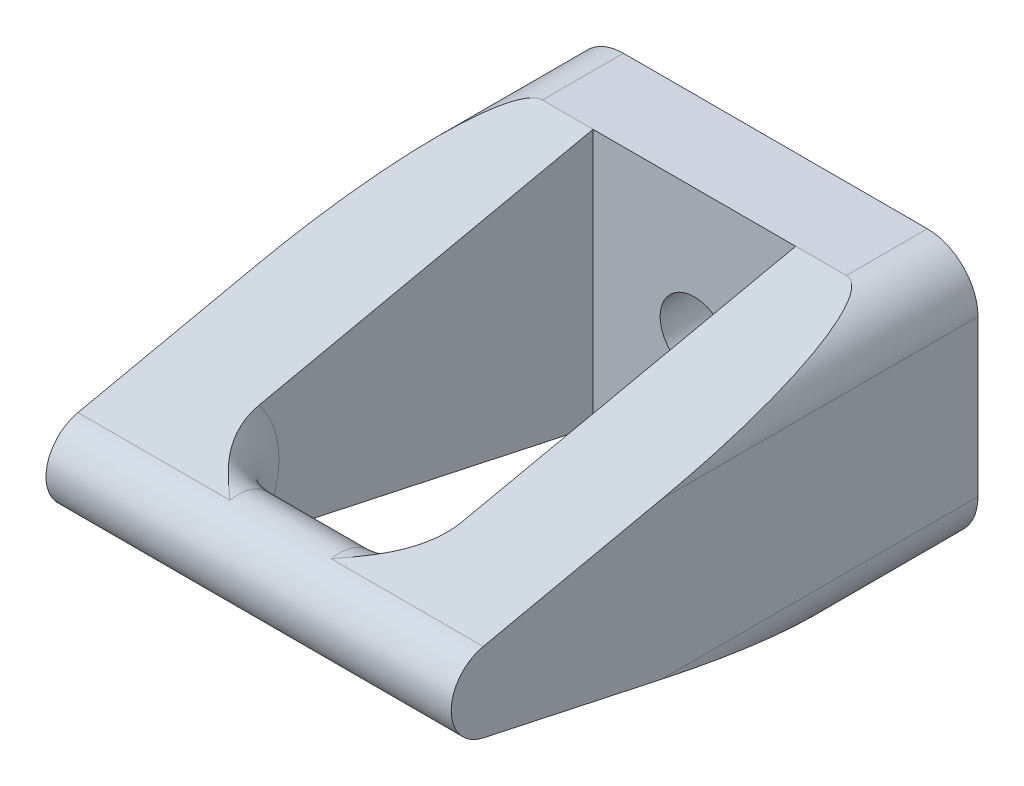
ISO-10303-21;
HEADER;
FILE_DESCRIPTION(('STEP AP214'),'2;1');
FILE_NAME('part.step','',(''),(''),'','','');
FILE_SCHEMA(('AUTOMOTIVE_DESIGN { 1 0 10303 214 1 1 1 1 }'));
ENDSEC;
DATA;
#1=APPLICATION_CONTEXT('core data for automotive mechanical design processes');
#2=APPLICATION_PROTOCOL_DEFINITION('international standard','automotive_design',2000,#1);
#3=PRODUCT_CONTEXT('',#1,'mechanical');
#4=PRODUCT('Part','Part','',(#3));
#5=PRODUCT_RELATED_PRODUCT_CATEGORY('part','',(#4));
#6=PRODUCT_DEFINITION_FORMATION('','',#4);
#7=PRODUCT_DEFINITION_CONTEXT('part definition',#1,'design');
#8=PRODUCT_DEFINITION('design','',#6,#7);
#9=PRODUCT_DEFINITION_SHAPE('','',#8);
#10=(LENGTH_UNIT() NAMED_UNIT(*) SI_UNIT(.MILLI.,.METRE.));
#11=(NAMED_UNIT(*) PLANE_ANGLE_UNIT() SI_UNIT($,.RADIAN.));
#12=(NAMED_UNIT(*) SI_UNIT($,.STERADIAN.) SOLID_ANGLE_UNIT());
#13=UNCERTAINTY_MEASURE_WITH_UNIT(LENGTH_MEASURE(1.E-05),#10,'distance_accuracy_value','');
#14=(GEOMETRIC_REPRESENTATION_CONTEXT(3) GLOBAL_UNCERTAINTY_ASSIGNED_CONTEXT((#13)) GLOBAL_UNIT_ASSIGNED_CONTEXT((#10,
#11,#12)) REPRESENTATION_CONTEXT('',''));
#15=CARTESIAN_POINT('',(0.,0.,0.));
#16=DIRECTION('',(0.,0.,1.));
#17=DIRECTION('',(1.,0.,0.));
#18=AXIS2_PLACEMENT_3D('',#15,#16,#17);
#19=CARTESIAN_POINT('',(10.,0.,48.));
#20=DIRECTION('',(-1.,0.,0.));
#21=DIRECTION('',(0.,0.,-1.));
#22=AXIS2_PLACEMENT_3D('',#19,#20,#21);
#23=PLANE('',#22);
#24=DIRECTION('',(0.,0.210393339679603,0.977616817888514));
#25=VECTOR('',#24,1.);
#26=CARTESIAN_POINT('',(10.,-3.91046727155406,48.8415733587184));
#27=LINE('',#26,#25);
#28=CARTESIAN_POINT('',(10.,-12.7,8.));
#29=VERTEX_POINT('',#28);
#30=CARTESIAN_POINT('',(10.,-5.60671260457634,40.9597745938298));
#31=VERTEX_POINT('',#30);
#32=EDGE_CURVE('E190',#29,#31,#27,.T.);
#33=ORIENTED_EDGE('',*,*,#32,.T.);
#34=CARTESIAN_POINT('',(10.,0.,48.));
#35=DIRECTION('',(-1.,0.,0.));
#36=DIRECTION('',(0.,0.,1.));
#37=AXIS2_PLACEMENT_3D('',#34,#35,#36);
#38=CIRCLE('',#37,9.);
#39=CARTESIAN_POINT('',(10.,5.60671260457634,40.9597745938298));
#40=VERTEX_POINT('',#39);
#41=EDGE_CURVE('E329',#31,#40,#38,.F.);
#42=ORIENTED_EDGE('',*,*,#41,.T.);
#43=DIRECTION('',(0.,0.210393339679603,-0.977616817888514));
#44=VECTOR('',#43,1.);
#45=CARTESIAN_POINT('',(10.,12.7,8.));
#46=LINE('',#45,#44);
#47=CARTESIAN_POINT('',(10.,12.7,8.));
#48=VERTEX_POINT('',#47);
#49=EDGE_CURVE('E382',#40,#48,#46,.T.);
#50=ORIENTED_EDGE('',*,*,#49,.T.);
#51=DIRECTION('',(0.,-1.,0.));
#52=VECTOR('',#51,1.);
#53=CARTESIAN_POINT('',(10.,-12.7,8.));
#54=LINE('',#53,#52);
#55=EDGE_CURVE('E208',#48,#29,#54,.T.);
#56=ORIENTED_EDGE('',*,*,#55,.T.);
#57=EDGE_LOOP('',(#33,#42,#50,#56));
#58=FACE_BOUND('',#57,.T.);
#59=ADVANCED_FACE('F47',(#58),#23,.T.);
#60=CARTESIAN_POINT('',(20.,-12.7,8.));
#61=DIRECTION('',(-1.,0.,0.));
#62=DIRECTION('',(0.,0.,1.));
#63=AXIS2_PLACEMENT_3D('',#60,#61,#62);
#64=PLANE('',#63);
#65=DIRECTION('',(0.,1.,0.));
#66=VECTOR('',#65,1.);
#67=CARTESIAN_POINT('',(20.,-12.7,0.));
#68=LINE('',#67,#66);
#69=CARTESIAN_POINT('',(20.,-7.7,0.));
#70=VERTEX_POINT('',#69);
#71=CARTESIAN_POINT('',(20.,7.7,0.));
#72=VERTEX_POINT('',#71);
#73=EDGE_CURVE('E241',#70,#72,#68,.T.);
#74=ORIENTED_EDGE('',*,*,#73,.T.);
#75=DIRECTION('',(0.,0.,-1.));
#76=VECTOR('',#75,1.);
#77=CARTESIAN_POINT('',(20.,7.7,8.));
#78=LINE('',#77,#76);
#79=CARTESIAN_POINT('',(20.,7.7,31.2330742830851));
#80=VERTEX_POINT('',#79);
#81=EDGE_CURVE('E195',#72,#80,#78,.F.);
#82=ORIENTED_EDGE('',*,*,#81,.T.);
#83=DIRECTION('',(0.,0.210393339679603,-0.977616817888514));
#84=VECTOR('',#83,1.);
#85=CARTESIAN_POINT('',(20.,12.7,8.));
#86=LINE('',#85,#84);
#87=CARTESIAN_POINT('',(20.,3.91046727155405,48.8415733587184));
#88=VERTEX_POINT('',#87);
#89=EDGE_CURVE('E179',#88,#80,#86,.T.);
#90=ORIENTED_EDGE('',*,*,#89,.F.);
#91=CARTESIAN_POINT('',(20.,0.,48.));
#92=DIRECTION('',(-1.,0.,0.));
#93=DIRECTION('',(0.,0.,-1.));
#94=AXIS2_PLACEMENT_3D('',#91,#92,#93);
#95=CIRCLE('',#94,4.);
#96=CARTESIAN_POINT('',(20.,-3.91046727155405,48.8415733587184));
#97=VERTEX_POINT('',#96);
#98=EDGE_CURVE('E167',#97,#88,#95,.T.);
#99=ORIENTED_EDGE('',*,*,#98,.F.);
#100=DIRECTION('',(0.,0.210393339679603,0.977616817888514));
#101=VECTOR('',#100,1.);
#102=CARTESIAN_POINT('',(20.,-3.91046727155406,48.8415733587184));
#103=LINE('',#102,#101);
#104=CARTESIAN_POINT('',(20.,-7.7,31.2330742830851));
#105=VERTEX_POINT('',#104);
#106=EDGE_CURVE('E178',#105,#97,#103,.T.);
#107=ORIENTED_EDGE('',*,*,#106,.F.);
#108=DIRECTION('',(0.,0.,-1.));
#109=VECTOR('',#108,1.);
#110=CARTESIAN_POINT('',(20.,-7.7,8.));
#111=LINE('',#110,#109);
#112=EDGE_CURVE('E290',#105,#70,#111,.T.);
#113=ORIENTED_EDGE('',*,*,#112,.T.);
#114=EDGE_LOOP('',(#74,#82,#90,#99,#107,#113));
#115=FACE_BOUND('',#114,.T.);
#116=ADVANCED_FACE('F193',(#115),#64,.F.);
#117=CARTESIAN_POINT('',(-20.,12.7,8.));
#118=DIRECTION('',(0.,-1.,0.));
#119=DIRECTION('',(0.,0.,-1.));
#120=AXIS2_PLACEMENT_3D('',#117,#118,#119);
#121=PLANE('',#120);
#122=DIRECTION('',(-1.,0.,0.));
#123=VECTOR('',#122,1.);
#124=CARTESIAN_POINT('',(-20.,12.7,8.));
#125=LINE('',#124,#123);
#126=CARTESIAN_POINT('',(15.,12.7,8.));
#127=VERTEX_POINT('',#126);
#128=EDGE_CURVE('E248',#127,#48,#125,.T.);
#129=ORIENTED_EDGE('',*,*,#128,.F.);
#130=DIRECTION('',(0.,0.,-1.));
#131=VECTOR('',#130,1.);
#132=CARTESIAN_POINT('',(15.,12.7,8.));
#133=LINE('',#132,#131);
#134=CARTESIAN_POINT('',(15.,12.7,0.));
#135=VERTEX_POINT('',#134);
#136=EDGE_CURVE('E274',#127,#135,#133,.T.);
#137=ORIENTED_EDGE('',*,*,#136,.T.);
#138=DIRECTION('',(-1.,0.,0.));
#139=VECTOR('',#138,1.);
#140=CARTESIAN_POINT('',(-20.,12.7,0.));
#141=LINE('',#140,#139);
#142=CARTESIAN_POINT('',(-15.,12.7,0.));
#143=VERTEX_POINT('',#142);
#144=EDGE_CURVE('E260',#135,#143,#141,.T.);
#145=ORIENTED_EDGE('',*,*,#144,.T.);
#146=DIRECTION('',(0.,0.,-1.));
#147=VECTOR('',#146,1.);
#148=CARTESIAN_POINT('',(-15.,12.7,8.));
#149=LINE('',#148,#147);
#150=CARTESIAN_POINT('',(-15.,12.7,8.));
#151=VERTEX_POINT('',#150);
#152=EDGE_CURVE('E257',#143,#151,#149,.F.);
#153=ORIENTED_EDGE('',*,*,#152,.T.);
#154=DIRECTION('',(-1.,0.,0.));
#155=VECTOR('',#154,1.);
#156=CARTESIAN_POINT('',(-10.,12.7,8.));
#157=LINE('',#156,#155);
#158=CARTESIAN_POINT('',(-10.,12.7,8.));
#159=VERTEX_POINT('',#158);
#160=EDGE_CURVE('E237',#159,#151,#157,.T.);
#161=ORIENTED_EDGE('',*,*,#160,.F.);
#162=EDGE_CURVE('E253',#48,#159,#125,.T.);
#163=ORIENTED_EDGE('',*,*,#162,.F.);
#164=EDGE_LOOP('',(#129,#137,#145,#153,#161,#163));
#165=FACE_BOUND('',#164,.T.);
#166=ADVANCED_FACE('F405',(#165),#121,.F.);
#167=CARTESIAN_POINT('',(-20.,-12.7,8.));
#168=DIRECTION('',(1.,0.,0.));
#169=DIRECTION('',(0.,0.,-1.));
#170=AXIS2_PLACEMENT_3D('',#167,#168,#169);
#171=PLANE('',#170);
#172=DIRECTION('',(0.,-1.,0.));
#173=VECTOR('',#172,1.);
#174=CARTESIAN_POINT('',(-20.,-12.7,0.));
#175=LINE('',#174,#173);
#176=CARTESIAN_POINT('',(-20.,7.7,0.));
#177=VERTEX_POINT('',#176);
#178=CARTESIAN_POINT('',(-20.,-7.7,0.));
#179=VERTEX_POINT('',#178);
#180=EDGE_CURVE('E264',#177,#179,#175,.T.);
#181=ORIENTED_EDGE('',*,*,#180,.T.);
#182=DIRECTION('',(0.,0.,-1.));
#183=VECTOR('',#182,1.);
#184=CARTESIAN_POINT('',(-20.,-7.7,8.));
#185=LINE('',#184,#183);
#186=CARTESIAN_POINT('',(-20.,-7.7,31.2330742830851));
#187=VERTEX_POINT('',#186);
#188=EDGE_CURVE('E310',#179,#187,#185,.F.);
#189=ORIENTED_EDGE('',*,*,#188,.T.);
#190=DIRECTION('',(0.,0.210393339679603,0.977616817888514));
#191=VECTOR('',#190,1.);
#192=CARTESIAN_POINT('',(-20.,-3.91046727155406,48.8415733587184));
#193=LINE('',#192,#191);
#194=CARTESIAN_POINT('',(-20.,-3.91046727155405,48.8415733587184));
#195=VERTEX_POINT('',#194);
#196=EDGE_CURVE('E213',#187,#195,#193,.T.);
#197=ORIENTED_EDGE('',*,*,#196,.T.);
#198=CARTESIAN_POINT('',(-20.,0.,48.));
#199=DIRECTION('',(-1.,0.,0.));
#200=DIRECTION('',(0.,0.,-1.));
#201=AXIS2_PLACEMENT_3D('',#198,#199,#200);
#202=CIRCLE('',#201,4.);
#203=CARTESIAN_POINT('',(-20.,3.91046727155405,48.8415733587184));
#204=VERTEX_POINT('',#203);
#205=EDGE_CURVE('E230',#195,#204,#202,.T.);
#206=ORIENTED_EDGE('',*,*,#205,.T.);
#207=DIRECTION('',(0.,0.210393339679603,-0.977616817888514));
#208=VECTOR('',#207,1.);
#209=CARTESIAN_POINT('',(-20.,12.7,8.));
#210=LINE('',#209,#208);
#211=CARTESIAN_POINT('',(-20.,7.7,31.2330742830851));
#212=VERTEX_POINT('',#211);
#213=EDGE_CURVE('E221',#204,#212,#210,.T.);
#214=ORIENTED_EDGE('',*,*,#213,.T.);
#215=DIRECTION('',(0.,0.,-1.));
#216=VECTOR('',#215,1.);
#217=CARTESIAN_POINT('',(-20.,7.7,8.));
#218=LINE('',#217,#216);
#219=EDGE_CURVE('E306',#212,#177,#218,.T.);
#220=ORIENTED_EDGE('',*,*,#219,.T.);
#221=EDGE_LOOP('',(#181,#189,#197,#206,#214,#220));
#222=FACE_BOUND('',#221,.T.);
#223=ADVANCED_FACE('F414',(#222),#171,.F.);
#224=CARTESIAN_POINT('',(-20.,-12.7,8.));
#225=DIRECTION('',(0.,1.,0.));
#226=DIRECTION('',(0.,0.,1.));
#227=AXIS2_PLACEMENT_3D('',#224,#225,#226);
#228=PLANE('',#227);
#229=DIRECTION('',(1.,0.,0.));
#230=VECTOR('',#229,1.);
#231=CARTESIAN_POINT('',(-20.,-12.7,8.));
#232=LINE('',#231,#230);
#233=CARTESIAN_POINT('',(-15.,-12.7,8.));
#234=VERTEX_POINT('',#233);
#235=CARTESIAN_POINT('',(-10.,-12.7,8.));
#236=VERTEX_POINT('',#235);
#237=EDGE_CURVE('E254',#234,#236,#232,.T.);
#238=ORIENTED_EDGE('',*,*,#237,.F.);
#239=DIRECTION('',(0.,0.,-1.));
#240=VECTOR('',#239,1.);
#241=CARTESIAN_POINT('',(-15.,-12.7,8.));
#242=LINE('',#241,#240);
#243=CARTESIAN_POINT('',(-15.,-12.7,0.));
#244=VERTEX_POINT('',#243);
#245=EDGE_CURVE('E302',#234,#244,#242,.T.);
#246=ORIENTED_EDGE('',*,*,#245,.T.);
#247=DIRECTION('',(1.,0.,0.));
#248=VECTOR('',#247,1.);
#249=CARTESIAN_POINT('',(-20.,-12.7,0.));
#250=LINE('',#249,#248);
#251=CARTESIAN_POINT('',(15.,-12.7,0.));
#252=VERTEX_POINT('',#251);
#253=EDGE_CURVE('E268',#244,#252,#250,.T.);
#254=ORIENTED_EDGE('',*,*,#253,.T.);
#255=DIRECTION('',(0.,0.,-1.));
#256=VECTOR('',#255,1.);
#257=CARTESIAN_POINT('',(15.,-12.7,8.));
#258=LINE('',#257,#256);
#259=CARTESIAN_POINT('',(15.,-12.7,8.));
#260=VERTEX_POINT('',#259);
#261=EDGE_CURVE('E299',#252,#260,#258,.F.);
#262=ORIENTED_EDGE('',*,*,#261,.T.);
#263=DIRECTION('',(1.,0.,0.));
#264=VECTOR('',#263,1.);
#265=CARTESIAN_POINT('',(10.,-12.7,8.));
#266=LINE('',#265,#264);
#267=EDGE_CURVE('E209',#29,#260,#266,.T.);
#268=ORIENTED_EDGE('',*,*,#267,.F.);
#269=EDGE_CURVE('E252',#236,#29,#232,.T.);
#270=ORIENTED_EDGE('',*,*,#269,.F.);
#271=EDGE_LOOP('',(#238,#246,#254,#262,#268,#270));
#272=FACE_BOUND('',#271,.T.);
#273=ADVANCED_FACE('F429',(#272),#228,.F.);
#274=CARTESIAN_POINT('',(0.,0.,8.));
#275=DIRECTION('',(0.,0.,-1.));
#276=DIRECTION('',(-1.,0.,0.));
#277=AXIS2_PLACEMENT_3D('',#274,#275,#276);
#278=PLANE('',#277);
#279=CARTESIAN_POINT('',(0.,0.,8.));
#280=DIRECTION('',(0.,0.,-1.));
#281=DIRECTION('',(-1.,0.,0.));
#282=AXIS2_PLACEMENT_3D('',#279,#280,#281);
#283=CIRCLE('',#282,3.37819999999999);
#284=CARTESIAN_POINT('',(-3.37819999999999,0.,8.));
#285=VERTEX_POINT('',#284);
#286=EDGE_CURVE('E197',#285,#285,#283,.T.);
#287=ORIENTED_EDGE('',*,*,#286,.T.);
#288=EDGE_LOOP('',(#287));
#289=FACE_BOUND('',#288,.T.);
#290=ORIENTED_EDGE('',*,*,#269,.T.);
#291=ORIENTED_EDGE('',*,*,#55,.F.);
#292=ORIENTED_EDGE('',*,*,#162,.T.);
#293=DIRECTION('',(0.,-1.,0.));
#294=VECTOR('',#293,1.);
#295=CARTESIAN_POINT('',(-10.,-12.7,8.));
#296=LINE('',#295,#294);
#297=EDGE_CURVE('E216',#159,#236,#296,.T.);
#298=ORIENTED_EDGE('',*,*,#297,.T.);
#299=EDGE_LOOP('',(#290,#291,#292,#298));
#300=FACE_BOUND('',#299,.T.);
#301=ADVANCED_FACE('F397',(#289,#300),#278,.F.);
#302=CARTESIAN_POINT('',(0.,0.,0.));
#303=DIRECTION('',(0.,0.,-1.));
#304=DIRECTION('',(-1.,0.,0.));
#305=AXIS2_PLACEMENT_3D('',#302,#303,#304);
#306=PLANE('',#305);
#307=CARTESIAN_POINT('',(0.,0.,0.));
#308=DIRECTION('',(0.,0.,-1.));
#309=DIRECTION('',(-1.,0.,0.));
#310=AXIS2_PLACEMENT_3D('',#307,#308,#309);
#311=CIRCLE('',#310,3.37819999999999);
#312=CARTESIAN_POINT('',(-3.37819999999999,0.,0.));
#313=VERTEX_POINT('',#312);
#314=EDGE_CURVE('E201',#313,#313,#311,.T.);
#315=ORIENTED_EDGE('',*,*,#314,.F.);
#316=EDGE_LOOP('',(#315));
#317=FACE_BOUND('',#316,.T.);
#318=ORIENTED_EDGE('',*,*,#144,.F.);
#319=CARTESIAN_POINT('',(15.,7.7,0.));
#320=DIRECTION('',(0.,0.,-1.));
#321=DIRECTION('',(-1.,0.,0.));
#322=AXIS2_PLACEMENT_3D('',#319,#320,#321);
#323=CIRCLE('',#322,5.);
#324=EDGE_CURVE('E287',#135,#72,#323,.T.);
#325=ORIENTED_EDGE('',*,*,#324,.T.);
#326=ORIENTED_EDGE('',*,*,#73,.F.);
#327=CARTESIAN_POINT('',(15.,-7.7,0.));
#328=DIRECTION('',(0.,0.,-1.));
#329=DIRECTION('',(-1.,0.,0.));
#330=AXIS2_PLACEMENT_3D('',#327,#328,#329);
#331=CIRCLE('',#330,5.);
#332=EDGE_CURVE('E281',#70,#252,#331,.T.);
#333=ORIENTED_EDGE('',*,*,#332,.T.);
#334=ORIENTED_EDGE('',*,*,#253,.F.);
#335=CARTESIAN_POINT('',(-15.,-7.7,0.));
#336=DIRECTION('',(0.,0.,-1.));
#337=DIRECTION('',(-1.,0.,0.));
#338=AXIS2_PLACEMENT_3D('',#335,#336,#337);
#339=CIRCLE('',#338,5.);
#340=EDGE_CURVE('E284',#244,#179,#339,.T.);
#341=ORIENTED_EDGE('',*,*,#340,.T.);
#342=ORIENTED_EDGE('',*,*,#180,.F.);
#343=CARTESIAN_POINT('',(-15.,7.7,0.));
#344=DIRECTION('',(0.,0.,-1.));
#345=DIRECTION('',(-1.,0.,0.));
#346=AXIS2_PLACEMENT_3D('',#343,#344,#345);
#347=CIRCLE('',#346,5.);
#348=EDGE_CURVE('E278',#177,#143,#347,.T.);
#349=ORIENTED_EDGE('',*,*,#348,.T.);
#350=EDGE_LOOP('',(#318,#325,#326,#333,#334,#341,#342,#349));
#351=FACE_BOUND('',#350,.T.);
#352=ADVANCED_FACE('F368',(#317,#351),#306,.T.);
#353=CARTESIAN_POINT('',(-10.,12.7,8.));
#354=DIRECTION('',(0.,0.977616817888514,0.210393339679603));
#355=DIRECTION('',(0.,-0.210393339679603,0.977616817888514));
#356=AXIS2_PLACEMENT_3D('',#353,#354,#355);
#357=PLANE('',#356);
#358=ORIENTED_EDGE('',*,*,#160,.T.);
#359=CARTESIAN_POINT('',(-15.,7.7,31.2330742830851));
#360=DIRECTION('',(0.,0.977616817888514,0.210393339679603));
#361=DIRECTION('',(0.,0.210393339679603,-0.977616817888514));
#362=AXIS2_PLACEMENT_3D('',#359,#360,#361);
#363=ELLIPSE('',#362,23.7650108487951,5.);
#364=EDGE_CURVE('E319',#151,#212,#363,.T.);
#365=ORIENTED_EDGE('',*,*,#364,.T.);
#366=ORIENTED_EDGE('',*,*,#213,.F.);
#367=DIRECTION('',(-1.,0.,0.));
#368=VECTOR('',#367,1.);
#369=CARTESIAN_POINT('',(-10.,3.91046727155405,48.8415733587184));
#370=LINE('',#369,#368);
#371=CARTESIAN_POINT('',(-5.,3.91046727155405,48.8415733587184));
#372=VERTEX_POINT('',#371);
#373=EDGE_CURVE('E242',#372,#204,#370,.T.);
#374=ORIENTED_EDGE('',*,*,#373,.F.);
#375=CARTESIAN_POINT('',(-10.,5.60671260457634,40.9597745938298));
#376=CARTESIAN_POINT('',(-10.0000289231619,5.56623160408805,41.1478742121094));
#377=CARTESIAN_POINT('',(-9.99109118449513,5.52576819177667,41.3358921049049));
#378=CARTESIAN_POINT('',(-9.95628550686387,5.44521203783271,41.7102055266128));
#379=CARTESIAN_POINT('',(-9.93043820713415,5.40511890467157,41.8965028748077));
#380=CARTESIAN_POINT('',(-9.86314835464645,5.32593482372407,42.2644408017459));
#381=CARTESIAN_POINT('',(-9.82186358974756,5.28683787280203,42.4461092747487));
#382=CARTESIAN_POINT('',(-9.72477239865065,5.20944057516995,42.8057447077879));
#383=CARTESIAN_POINT('',(-9.66896025405437,5.17114054857812,42.9837101803583));
#384=CARTESIAN_POINT('',(-9.52452337240954,5.08374508734545,43.3898032289229));
#385=CARTESIAN_POINT('',(-9.4310926180227,5.03500004706225,43.6163026572892));
#386=CARTESIAN_POINT('',(-9.22402935699943,4.93945435435374,44.0602666925144));
#387=CARTESIAN_POINT('',(-9.11039188336679,4.89265418349254,44.2777290617302));
#388=CARTESIAN_POINT('',(-8.86527712909746,4.80096691086088,44.7037645049032));
#389=CARTESIAN_POINT('',(-8.73373890894822,4.75608706397146,44.9123038682223));
#390=CARTESIAN_POINT('',(-8.45582317177822,4.66840173459285,45.3197438224203));
#391=CARTESIAN_POINT('',(-8.30943999882095,4.62559705199268,45.518640696523));
#392=CARTESIAN_POINT('',(-7.92935552535192,4.52137800182044,46.0029064833959));
#393=CARTESIAN_POINT('',(-7.68814998906798,4.4611783349546,46.2826311498181));
#394=CARTESIAN_POINT('',(-7.18639773791661,4.34446489458465,46.824953555808));
#395=CARTESIAN_POINT('',(-6.9258397977504,4.28795329660081,47.0875411865709));
#396=CARTESIAN_POINT('',(-6.12584282554718,4.12240981863182,47.8567579707175));
#397=CARTESIAN_POINT('',(-5.56809358742252,4.01737248802779,48.3448259916013));
#398=CARTESIAN_POINT('',(-5.00702726992517,3.9117896732642,48.8354286672856));
#399=CARTESIAN_POINT('',(-5.00351362797967,3.91112847076321,48.83850102065));
#400=CARTESIAN_POINT('',(-5.,3.91046727155405,48.8415733587184));
#401=B_SPLINE_CURVE_WITH_KNOTS('',3,(#375,#376,#377,#378,#379,#380,#381,#382,#383,#384,#385,
#386,#387,#388,#389,#390,#391,#392,#393,#394,#395,#396,#397,#398,#399,#400),.UNSPECIFIED.,.F.,
.F.,(4,2,2,2,2,2,2,2,2,2,2,2,4),(0.,0.576888273261554,1.15307372674248,1.72352412688892,
2.29419941333772,3.04250132784724,3.79098743671872,4.54208851530397,5.29347684675067,
6.41484183930379,7.53686243357793,9.78096358219236,9.79510571781599),.UNSPECIFIED.);
#402=CARTESIAN_POINT('',(-10.,5.60671260457634,40.9597745938298));
#403=VERTEX_POINT('',#402);
#404=EDGE_CURVE('E62',#372,#403,#401,.F.);
#405=ORIENTED_EDGE('',*,*,#404,.T.);
#406=DIRECTION('',(0.,0.210393339679603,-0.977616817888514));
#407=VECTOR('',#406,1.);
#408=CARTESIAN_POINT('',(-10.,12.7,8.));
#409=LINE('',#408,#407);
#410=EDGE_CURVE('E224',#403,#159,#409,.T.);
#411=ORIENTED_EDGE('',*,*,#410,.T.);
#412=EDGE_LOOP('',(#358,#365,#366,#374,#405,#411));
#413=FACE_BOUND('',#412,.T.);
#414=ADVANCED_FACE('F364',(#413),#357,.T.);
#415=CARTESIAN_POINT('',(-10.,0.,48.));
#416=DIRECTION('',(-1.,0.,0.));
#417=DIRECTION('',(0.,0.,1.));
#418=AXIS2_PLACEMENT_3D('',#415,#416,#417);
#419=CYLINDRICAL_SURFACE('',#418,4.);
#420=CARTESIAN_POINT('',(-5.,0.,48.));
#421=DIRECTION('',(1.,0.,0.));
#422=DIRECTION('',(0.,0.,-1.));
#423=AXIS2_PLACEMENT_3D('',#420,#421,#422);
#424=CIRCLE('',#423,4.);
#425=CARTESIAN_POINT('',(-5.,-3.91046727155405,48.8415733587184));
#426=VERTEX_POINT('',#425);
#427=EDGE_CURVE('E322',#426,#372,#424,.T.);
#428=ORIENTED_EDGE('',*,*,#427,.T.);
#429=ORIENTED_EDGE('',*,*,#373,.T.);
#430=ORIENTED_EDGE('',*,*,#205,.F.);
#431=DIRECTION('',(-1.,0.,0.));
#432=VECTOR('',#431,1.);
#433=CARTESIAN_POINT('',(-10.,-3.91046727155405,48.8415733587184));
#434=LINE('',#433,#432);
#435=EDGE_CURVE('E227',#426,#195,#434,.T.);
#436=ORIENTED_EDGE('',*,*,#435,.F.);
#437=EDGE_LOOP('',(#428,#429,#430,#436));
#438=FACE_BOUND('',#437,.T.);
#439=CARTESIAN_POINT('',(5.,0.,48.));
#440=DIRECTION('',(-1.,0.,0.));
#441=DIRECTION('',(0.,0.,1.));
#442=AXIS2_PLACEMENT_3D('',#439,#440,#441);
#443=CIRCLE('',#442,4.);
#444=CARTESIAN_POINT('',(5.,3.91046727155405,48.8415733587184));
#445=VERTEX_POINT('',#444);
#446=CARTESIAN_POINT('',(5.,-3.91046727155405,48.8415733587184));
#447=VERTEX_POINT('',#446);
#448=EDGE_CURVE('E326',#445,#447,#443,.T.);
#449=ORIENTED_EDGE('',*,*,#448,.T.);
#450=DIRECTION('',(1.,0.,0.));
#451=VECTOR('',#450,1.);
#452=CARTESIAN_POINT('',(10.,-3.91046727155405,48.8415733587184));
#453=LINE('',#452,#451);
#454=EDGE_CURVE('E173',#447,#97,#453,.T.);
#455=ORIENTED_EDGE('',*,*,#454,.T.);
#456=ORIENTED_EDGE('',*,*,#98,.T.);
#457=DIRECTION('',(1.,0.,0.));
#458=VECTOR('',#457,1.);
#459=CARTESIAN_POINT('',(10.,3.91046727155405,48.8415733587184));
#460=LINE('',#459,#458);
#461=EDGE_CURVE('E171',#445,#88,#460,.T.);
#462=ORIENTED_EDGE('',*,*,#461,.F.);
#463=EDGE_LOOP('',(#449,#455,#456,#462));
#464=FACE_BOUND('',#463,.T.);
#465=ADVANCED_FACE('F170',(#438,#464),#419,.T.);
#466=CARTESIAN_POINT('',(-10.,-3.91046727155406,48.8415733587184));
#467=DIRECTION('',(0.,-0.977616817888514,0.210393339679603));
#468=DIRECTION('',(0.,-0.210393339679603,-0.977616817888514));
#469=AXIS2_PLACEMENT_3D('',#466,#467,#468);
#470=PLANE('',#469);
#471=ORIENTED_EDGE('',*,*,#196,.F.);
#472=CARTESIAN_POINT('',(-15.,-7.7,31.2330742830851));
#473=DIRECTION('',(0.,-0.977616817888514,0.210393339679603));
#474=DIRECTION('',(0.,-0.210393339679603,-0.977616817888514));
#475=AXIS2_PLACEMENT_3D('',#472,#473,#474);
#476=ELLIPSE('',#475,23.7650108487951,5.);
#477=EDGE_CURVE('E313',#187,#234,#476,.T.);
#478=ORIENTED_EDGE('',*,*,#477,.T.);
#479=ORIENTED_EDGE('',*,*,#237,.T.);
#480=DIRECTION('',(0.,0.210393339679603,0.977616817888514));
#481=VECTOR('',#480,1.);
#482=CARTESIAN_POINT('',(-10.,-3.91046727155406,48.8415733587184));
#483=LINE('',#482,#481);
#484=CARTESIAN_POINT('',(-10.,-5.60671260457634,40.9597745938298));
#485=VERTEX_POINT('',#484);
#486=EDGE_CURVE('E220',#236,#485,#483,.T.);
#487=ORIENTED_EDGE('',*,*,#486,.T.);
#488=CARTESIAN_POINT('',(-10.,-5.60671260457634,40.9597745938298));
#489=CARTESIAN_POINT('',(-10.0000289231619,-5.56623160408789,41.1478742121102));
#490=CARTESIAN_POINT('',(-9.99109118449506,-5.52576819177635,41.3358921049064));
#491=CARTESIAN_POINT('',(-9.95628550686352,-5.44521203783205,41.7102055266159));
#492=CARTESIAN_POINT('',(-9.93043820713358,-5.40511890467074,41.8965028748115));
#493=CARTESIAN_POINT('',(-9.86314835464562,-5.32593482372325,42.2644408017497));
#494=CARTESIAN_POINT('',(-9.8218635897468,-5.28683787280137,42.4461092747517));
#495=CARTESIAN_POINT('',(-9.72477239865017,-5.20944057516963,42.8057447077894));
#496=CARTESIAN_POINT('',(-9.6689602540541,-5.17114054857797,42.9837101803591));
#497=CARTESIAN_POINT('',(-9.52452337240977,-5.08374508734559,43.3898032289223));
#498=CARTESIAN_POINT('',(-9.43109261802323,-5.03500004706253,43.616302657288));
#499=CARTESIAN_POINT('',(-9.2240293570006,-4.93945435435425,44.060266692512));
#500=CARTESIAN_POINT('',(-9.11039188336831,-4.89265418349316,44.2777290617274));
#501=CARTESIAN_POINT('',(-8.86527712909916,-4.80096691086147,44.7037645049005));
#502=CARTESIAN_POINT('',(-8.7337389089497,-4.75608706397192,44.9123038682202));
#503=CARTESIAN_POINT('',(-8.45582317177896,-4.66840173459309,45.3197438224192));
#504=CARTESIAN_POINT('',(-8.30943999882119,-4.62559705199284,45.5186406965223));
#505=CARTESIAN_POINT('',(-7.92935552535204,-4.52137800182034,46.0029064833963));
#506=CARTESIAN_POINT('',(-7.68814998906888,-4.46117833495425,46.2826311498197));
#507=CARTESIAN_POINT('',(-7.1863977379144,-4.3444648945847,46.8249535558078));
#508=CARTESIAN_POINT('',(-6.92583979774426,-4.28795329660151,47.0875411865676));
#509=CARTESIAN_POINT('',(-6.1258428255546,-4.12240981862943,47.8567579707287));
#510=CARTESIAN_POINT('',(-5.56809358747095,-4.01737248801617,48.3448259916557));
#511=CARTESIAN_POINT('',(-5.00702726992583,-3.91178967326407,48.8354286672863));
#512=CARTESIAN_POINT('',(-5.00351362798,-3.91112847076314,48.8385010206503));
#513=CARTESIAN_POINT('',(-5.,-3.91046727155406,48.8415733587184));
#514=B_SPLINE_CURVE_WITH_KNOTS('',3,(#488,#489,#490,#491,#492,#493,#494,#495,#496,#497,#498,
#499,#500,#501,#502,#503,#504,#505,#506,#507,#508,#509,#510,#511,#512,#513),.UNSPECIFIED.,.F.,
.F.,(4,2,2,2,2,2,2,2,2,2,2,2,4),(0.,0.576888273263875,1.15307372674723,1.72352412689135,
2.29419941333772,3.04250132784515,3.79098743671482,4.54208851530194,5.29347684675068,
6.41484183930445,7.53686243358112,9.78096358219228,9.795105717816),.UNSPECIFIED.);
#515=EDGE_CURVE('E11',#485,#426,#514,.T.);
#516=ORIENTED_EDGE('',*,*,#515,.T.);
#517=ORIENTED_EDGE('',*,*,#435,.T.);
#518=EDGE_LOOP('',(#471,#478,#479,#487,#516,#517));
#519=FACE_BOUND('',#518,.T.);
#520=ADVANCED_FACE('F363',(#519),#470,.T.);
#521=CARTESIAN_POINT('',(-10.,0.,48.));
#522=DIRECTION('',(1.,0.,0.));
#523=DIRECTION('',(0.,0.,-1.));
#524=AXIS2_PLACEMENT_3D('',#521,#522,#523);
#525=PLANE('',#524);
#526=ORIENTED_EDGE('',*,*,#410,.F.);
#527=CARTESIAN_POINT('',(-10.,0.,48.));
#528=DIRECTION('',(1.,0.,0.));
#529=DIRECTION('',(0.,0.,-1.));
#530=AXIS2_PLACEMENT_3D('',#527,#528,#529);
#531=CIRCLE('',#530,9.);
#532=EDGE_CURVE('E69',#403,#485,#531,.F.);
#533=ORIENTED_EDGE('',*,*,#532,.T.);
#534=ORIENTED_EDGE('',*,*,#486,.F.);
#535=ORIENTED_EDGE('',*,*,#297,.F.);
#536=EDGE_LOOP('',(#526,#533,#534,#535));
#537=FACE_BOUND('',#536,.T.);
#538=ADVANCED_FACE('F354',(#537),#525,.T.);
#539=CARTESIAN_POINT('',(10.,-3.91046727155406,48.8415733587184));
#540=DIRECTION('',(0.,0.977616817888514,-0.210393339679603));
#541=DIRECTION('',(0.,0.210393339679603,0.977616817888514));
#542=AXIS2_PLACEMENT_3D('',#539,#540,#541);
#543=PLANE('',#542);
#544=ORIENTED_EDGE('',*,*,#267,.T.);
#545=CARTESIAN_POINT('',(15.,-7.7,31.2330742830851));
#546=DIRECTION('',(0.,0.977616817888514,-0.210393339679603));
#547=DIRECTION('',(0.,-0.210393339679603,-0.977616817888514));
#548=AXIS2_PLACEMENT_3D('',#545,#546,#547);
#549=ELLIPSE('',#548,23.7650108487951,5.);
#550=EDGE_CURVE('E316',#260,#105,#549,.F.);
#551=ORIENTED_EDGE('',*,*,#550,.T.);
#552=ORIENTED_EDGE('',*,*,#106,.T.);
#553=ORIENTED_EDGE('',*,*,#454,.F.);
#554=CARTESIAN_POINT('',(10.,-5.60671260457634,40.9597745938298));
#555=CARTESIAN_POINT('',(10.0000289231619,-5.56623160408787,41.1478742121102));
#556=CARTESIAN_POINT('',(9.99109118449505,-5.5257681917763,41.3358921049066));
#557=CARTESIAN_POINT('',(9.95628550686347,-5.44521203783197,41.7102055266162));
#558=CARTESIAN_POINT('',(9.93043820713351,-5.40511890467064,41.896502874812));
#559=CARTESIAN_POINT('',(9.86314835464551,-5.32593482372315,42.2644408017502));
#560=CARTESIAN_POINT('',(9.82186358974671,-5.28683787280129,42.4461092747521));
#561=CARTESIAN_POINT('',(9.72477239865011,-5.20944057516959,42.8057447077896));
#562=CARTESIAN_POINT('',(9.66896025405407,-5.17114054857794,42.9837101803592));
#563=CARTESIAN_POINT('',(9.52452337240979,-5.08374508734561,43.3898032289222));
#564=CARTESIAN_POINT('',(9.43109261802329,-5.03500004706256,43.6163026572878));
#565=CARTESIAN_POINT('',(9.22402935700075,-4.93945435435432,44.0602666925117));
#566=CARTESIAN_POINT('',(9.11039188336849,-4.89265418349324,44.277729061727));
#567=CARTESIAN_POINT('',(8.86527712909937,-4.80096691086154,44.7037645049002));
#568=CARTESIAN_POINT('',(8.73373890894988,-4.75608706397198,44.9123038682199));
#569=CARTESIAN_POINT('',(8.45582317177906,-4.66840173459312,45.319743822419));
#570=CARTESIAN_POINT('',(8.30943999882122,-4.62559705199285,45.5186406965222));
#571=CARTESIAN_POINT('',(7.92935552535206,-4.52137800182033,46.0029064833964));
#572=CARTESIAN_POINT('',(7.68814998906899,-4.46117833495421,46.2826311498199));
#573=CARTESIAN_POINT('',(7.18639773791413,-4.34446489458471,46.8249535558077));
#574=CARTESIAN_POINT('',(6.92583979774351,-4.2879532966016,47.0875411865672));
#575=CARTESIAN_POINT('',(6.12584282555554,-4.12240981862912,47.8567579707301));
#576=CARTESIAN_POINT('',(5.568093587477,-4.01737248801467,48.3448259916624));
#577=CARTESIAN_POINT('',(5.00702726992593,-3.91178967326405,48.8354286672863));
#578=CARTESIAN_POINT('',(5.00351362798005,-3.91112847076313,48.8385010206503));
#579=CARTESIAN_POINT('',(5.,-3.91046727155406,48.8415733587184));
#580=B_SPLINE_CURVE_WITH_KNOTS('',3,(#554,#555,#556,#557,#558,#559,#560,#561,#562,#563,#564,
#565,#566,#567,#568,#569,#570,#571,#572,#573,#574,#575,#576,#577,#578,#579),.UNSPECIFIED.,.F.,
.F.,(4,2,2,2,2,2,2,2,2,2,2,2,4),(0.,0.576888273264175,1.15307372674783,1.72352412689165,
2.29419941333772,3.04250132784489,3.79098743671435,4.54208851530169,5.29347684675067,
6.41484183930452,7.53686243358151,9.78096358219224,9.79510571781601),.UNSPECIFIED.);
#581=EDGE_CURVE('E334',#447,#31,#580,.F.);
#582=ORIENTED_EDGE('',*,*,#581,.T.);
#583=ORIENTED_EDGE('',*,*,#32,.F.);
#584=EDGE_LOOP('',(#544,#551,#552,#553,#582,#583));
#585=FACE_BOUND('',#584,.T.);
#586=ADVANCED_FACE('F350',(#585),#543,.F.);
#587=CARTESIAN_POINT('',(10.,12.7,8.));
#588=DIRECTION('',(0.,-0.977616817888514,-0.210393339679603));
#589=DIRECTION('',(0.,0.210393339679603,-0.977616817888514));
#590=AXIS2_PLACEMENT_3D('',#587,#588,#589);
#591=PLANE('',#590);
#592=ORIENTED_EDGE('',*,*,#89,.T.);
#593=CARTESIAN_POINT('',(15.,7.7,31.2330742830851));
#594=DIRECTION('',(0.,-0.977616817888514,-0.210393339679603));
#595=DIRECTION('',(0.,0.210393339679603,-0.977616817888514));
#596=AXIS2_PLACEMENT_3D('',#593,#594,#595);
#597=ELLIPSE('',#596,23.7650108487951,5.);
#598=EDGE_CURVE('E296',#80,#127,#597,.F.);
#599=ORIENTED_EDGE('',*,*,#598,.T.);
#600=ORIENTED_EDGE('',*,*,#128,.T.);
#601=ORIENTED_EDGE('',*,*,#49,.F.);
#602=CARTESIAN_POINT('',(10.,5.60671260457634,40.9597745938298));
#603=CARTESIAN_POINT('',(10.0000289231619,5.56623160408797,41.1478742121097));
#604=CARTESIAN_POINT('',(9.9910911844951,5.52576819177652,41.3358921049056));
#605=CARTESIAN_POINT('',(9.95628550686371,5.44521203783241,41.7102055266142));
#606=CARTESIAN_POINT('',(9.93043820713389,5.40511890467119,41.8965028748095));
#607=CARTESIAN_POINT('',(9.86314835464606,5.3259348237237,42.2644408017476));
#608=CARTESIAN_POINT('',(9.82186358974721,5.28683787280173,42.4461092747501));
#609=CARTESIAN_POINT('',(9.72477239865043,5.2094405751698,42.8057447077886));
#610=CARTESIAN_POINT('',(9.66896025405424,5.17114054857805,42.9837101803586));
#611=CARTESIAN_POINT('',(9.52452337240964,5.08374508734552,43.3898032289226));
#612=CARTESIAN_POINT('',(9.43109261802294,5.03500004706238,43.6163026572887));
#613=CARTESIAN_POINT('',(9.22402935699997,4.93945435435398,44.0602666925133));
#614=CARTESIAN_POINT('',(9.11039188336749,4.89265418349283,44.2777290617289));
#615=CARTESIAN_POINT('',(8.86527712909824,4.80096691086115,44.703764504902));
#616=CARTESIAN_POINT('',(8.7337389089489,4.75608706397167,44.9123038682213));
#617=CARTESIAN_POINT('',(8.45582317177857,4.66840173459296,45.3197438224198));
#618=CARTESIAN_POINT('',(8.30943999882106,4.62559705199275,45.5186406965227));
#619=CARTESIAN_POINT('',(7.92935552535198,4.52137800182039,46.0029064833961));
#620=CARTESIAN_POINT('',(7.6881499890684,4.46117833495444,46.2826311498188));
#621=CARTESIAN_POINT('',(7.18639773791561,4.34446489458468,46.8249535558078));
#622=CARTESIAN_POINT('',(6.9258397977476,4.28795329660114,47.0875411865694));
#623=CARTESIAN_POINT('',(6.12584282555063,4.12240981863071,47.8567579707227));
#624=CARTESIAN_POINT('',(5.56809358744487,4.01737248802238,48.3448259916263));
#625=CARTESIAN_POINT('',(5.00702726992551,3.91178967326415,48.8354286672859));
#626=CARTESIAN_POINT('',(5.00351362797984,3.91112847076318,48.8385010206501));
#627=CARTESIAN_POINT('',(5.,3.91046727155405,48.8415733587184));
#628=B_SPLINE_CURVE_WITH_KNOTS('',3,(#602,#603,#604,#605,#606,#607,#608,#609,#610,#611,#612,
#613,#614,#615,#616,#617,#618,#619,#620,#621,#622,#623,#624,#625,#626,#627),.UNSPECIFIED.,.F.,
.F.,(4,2,2,2,2,2,2,2,2,2,2,2,4),(0.,0.576888273262622,1.15307372674467,1.72352412689003,
2.29419941333772,3.04250132784629,3.79098743671692,4.54208851530303,5.29347684675067,
6.41484183930407,7.53686243357936,9.78096358219225,9.795105717816),.UNSPECIFIED.);
#629=EDGE_CURVE('E187',#40,#445,#628,.T.);
#630=ORIENTED_EDGE('',*,*,#629,.T.);
#631=ORIENTED_EDGE('',*,*,#461,.T.);
#632=EDGE_LOOP('',(#592,#599,#600,#601,#630,#631));
#633=FACE_BOUND('',#632,.T.);
#634=ADVANCED_FACE('F183',(#633),#591,.F.);
#635=CARTESIAN_POINT('',(15.,7.7,8.));
#636=DIRECTION('',(0.,0.,-1.));
#637=DIRECTION('',(-1.,0.,0.));
#638=AXIS2_PLACEMENT_3D('',#635,#636,#637);
#639=CYLINDRICAL_SURFACE('',#638,5.);
#640=ORIENTED_EDGE('',*,*,#598,.F.);
#641=ORIENTED_EDGE('',*,*,#81,.F.);
#642=ORIENTED_EDGE('',*,*,#324,.F.);
#643=ORIENTED_EDGE('',*,*,#136,.F.);
#644=EDGE_LOOP('',(#640,#641,#642,#643));
#645=FACE_BOUND('',#644,.T.);
#646=ADVANCED_FACE('F360',(#645),#639,.T.);
#647=CARTESIAN_POINT('',(-15.,-7.7,8.));
#648=DIRECTION('',(0.,0.,-1.));
#649=DIRECTION('',(-1.,0.,0.));
#650=AXIS2_PLACEMENT_3D('',#647,#648,#649);
#651=CYLINDRICAL_SURFACE('',#650,5.);
#652=ORIENTED_EDGE('',*,*,#477,.F.);
#653=ORIENTED_EDGE('',*,*,#188,.F.);
#654=ORIENTED_EDGE('',*,*,#340,.F.);
#655=ORIENTED_EDGE('',*,*,#245,.F.);
#656=EDGE_LOOP('',(#652,#653,#654,#655));
#657=FACE_BOUND('',#656,.T.);
#658=ADVANCED_FACE('F439',(#657),#651,.T.);
#659=CARTESIAN_POINT('',(15.,-7.7,8.));
#660=DIRECTION('',(0.,0.,-1.));
#661=DIRECTION('',(-1.,0.,0.));
#662=AXIS2_PLACEMENT_3D('',#659,#660,#661);
#663=CYLINDRICAL_SURFACE('',#662,5.);
#664=ORIENTED_EDGE('',*,*,#550,.F.);
#665=ORIENTED_EDGE('',*,*,#261,.F.);
#666=ORIENTED_EDGE('',*,*,#332,.F.);
#667=ORIENTED_EDGE('',*,*,#112,.F.);
#668=EDGE_LOOP('',(#664,#665,#666,#667));
#669=FACE_BOUND('',#668,.T.);
#670=ADVANCED_FACE('F435',(#669),#663,.T.);
#671=CARTESIAN_POINT('',(-15.,7.7,8.));
#672=DIRECTION('',(0.,0.,-1.));
#673=DIRECTION('',(-1.,0.,0.));
#674=AXIS2_PLACEMENT_3D('',#671,#672,#673);
#675=CYLINDRICAL_SURFACE('',#674,5.);
#676=ORIENTED_EDGE('',*,*,#364,.F.);
#677=ORIENTED_EDGE('',*,*,#152,.F.);
#678=ORIENTED_EDGE('',*,*,#348,.F.);
#679=ORIENTED_EDGE('',*,*,#219,.F.);
#680=EDGE_LOOP('',(#676,#677,#678,#679));
#681=FACE_BOUND('',#680,.T.);
#682=ADVANCED_FACE('F410',(#681),#675,.T.);
#683=CARTESIAN_POINT('',(5.,0.,48.));
#684=DIRECTION('',(-1.,0.,0.));
#685=DIRECTION('',(0.,0.,1.));
#686=AXIS2_PLACEMENT_3D('',#683,#684,#685);
#687=TOROIDAL_SURFACE('',#686,9.,5.);
#688=ORIENTED_EDGE('',*,*,#629,.F.);
#689=ORIENTED_EDGE('',*,*,#41,.F.);
#690=ORIENTED_EDGE('',*,*,#581,.F.);
#691=ORIENTED_EDGE('',*,*,#448,.F.);
#692=EDGE_LOOP('',(#688,#689,#690,#691));
#693=FACE_BOUND('',#692,.T.);
#694=ADVANCED_FACE('F347',(#693),#687,.F.);
#695=CARTESIAN_POINT('',(-5.,0.,48.));
#696=DIRECTION('',(1.,0.,0.));
#697=DIRECTION('',(0.,0.,-1.));
#698=AXIS2_PLACEMENT_3D('',#695,#696,#697);
#699=TOROIDAL_SURFACE('',#698,9.,5.);
#700=ORIENTED_EDGE('',*,*,#515,.F.);
#701=ORIENTED_EDGE('',*,*,#532,.F.);
#702=ORIENTED_EDGE('',*,*,#404,.F.);
#703=ORIENTED_EDGE('',*,*,#427,.F.);
#704=EDGE_LOOP('',(#700,#701,#702,#703));
#705=FACE_BOUND('',#704,.T.);
#706=ADVANCED_FACE('F49',(#705),#699,.F.);
#707=CARTESIAN_POINT('',(0.,0.,0.));
#708=DIRECTION('',(0.,0.,-1.));
#709=DIRECTION('',(-1.,0.,0.));
#710=AXIS2_PLACEMENT_3D('',#707,#708,#709);
#711=CYLINDRICAL_SURFACE('',#710,3.37819999999999);
#712=ORIENTED_EDGE('',*,*,#286,.F.);
#713=EDGE_LOOP('',(#712));
#714=FACE_BOUND('',#713,.T.);
#715=ORIENTED_EDGE('',*,*,#314,.T.);
#716=EDGE_LOOP('',(#715));
#717=FACE_BOUND('',#716,.T.);
#718=ADVANCED_FACE('F393',(#714,#717),#711,.F.);
#719=CLOSED_SHELL('',(#59,#116,#166,#223,#273,#301,#352,#414,#465,#520,#538,#586,#634,#646,#658,
#670,#682,#694,#706,#718));
#720=MANIFOLD_SOLID_BREP('B2',#719);
#721=ADVANCED_BREP_SHAPE_REPRESENTATION('',(#18,#720),#14);
#722=SHAPE_DEFINITION_REPRESENTATION(#9,#721);
ENDSEC;
END-ISO-10303-21;
